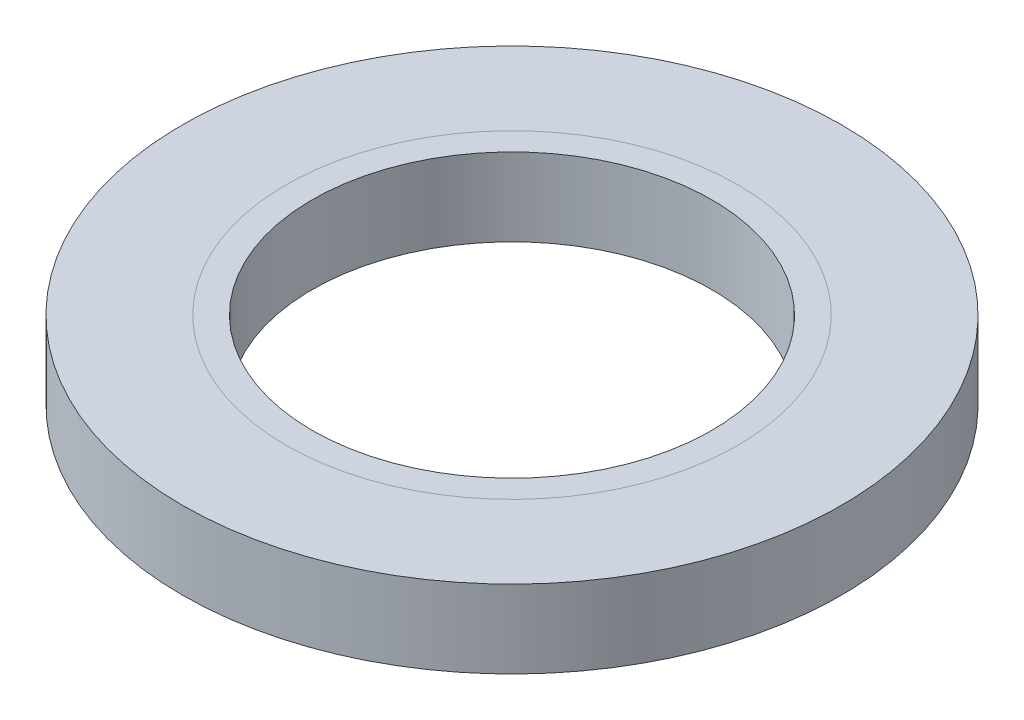
ISO-10303-21;
HEADER;
FILE_DESCRIPTION(('STEP AP214'),'2;1');
FILE_NAME('part.step','',(''),(''),'','','');
FILE_SCHEMA(('AUTOMOTIVE_DESIGN { 1 0 10303 214 1 1 1 1 }'));
ENDSEC;
DATA;
#1=APPLICATION_CONTEXT('core data for automotive mechanical design processes');
#2=APPLICATION_PROTOCOL_DEFINITION('international standard','automotive_design',2000,#1);
#3=PRODUCT_CONTEXT('',#1,'mechanical');
#4=PRODUCT('Part','Part','',(#3));
#5=PRODUCT_RELATED_PRODUCT_CATEGORY('part','',(#4));
#6=PRODUCT_DEFINITION_FORMATION('','',#4);
#7=PRODUCT_DEFINITION_CONTEXT('part definition',#1,'design');
#8=PRODUCT_DEFINITION('design','',#6,#7);
#9=PRODUCT_DEFINITION_SHAPE('','',#8);
#10=(LENGTH_UNIT() NAMED_UNIT(*) SI_UNIT(.MILLI.,.METRE.));
#11=(NAMED_UNIT(*) PLANE_ANGLE_UNIT() SI_UNIT($,.RADIAN.));
#12=(NAMED_UNIT(*) SI_UNIT($,.STERADIAN.) SOLID_ANGLE_UNIT());
#13=UNCERTAINTY_MEASURE_WITH_UNIT(LENGTH_MEASURE(1.E-05),#10,'distance_accuracy_value','');
#14=(GEOMETRIC_REPRESENTATION_CONTEXT(3) GLOBAL_UNCERTAINTY_ASSIGNED_CONTEXT((#13)) GLOBAL_UNIT_ASSIGNED_CONTEXT((#10,
#11,#12)) REPRESENTATION_CONTEXT('',''));
#15=CARTESIAN_POINT('',(0.,0.,0.));
#16=DIRECTION('',(0.,0.,1.));
#17=DIRECTION('',(1.,0.,0.));
#18=AXIS2_PLACEMENT_3D('',#15,#16,#17);
#19=CARTESIAN_POINT('',(0.,7.5,0.));
#20=DIRECTION('',(0.,1.,0.));
#21=DIRECTION('',(0.,0.,1.));
#22=AXIS2_PLACEMENT_3D('',#19,#20,#21);
#23=PLANE('',#22);
#24=CARTESIAN_POINT('',(0.,7.5,0.));
#25=DIRECTION('',(0.,1.,0.));
#26=DIRECTION('',(0.,0.,1.));
#27=AXIS2_PLACEMENT_3D('',#24,#25,#26);
#28=CIRCLE('',#27,63.5);
#29=CARTESIAN_POINT('',(0.,7.5,63.5));
#30=VERTEX_POINT('',#29);
#31=EDGE_CURVE('E11',#30,#30,#28,.T.);
#32=ORIENTED_EDGE('',*,*,#31,.T.);
#33=EDGE_LOOP('',(#32));
#34=FACE_BOUND('',#33,.T.);
#35=CARTESIAN_POINT('',(0.,7.5,0.));
#36=DIRECTION('',(0.,1.,0.));
#37=DIRECTION('',(0.,0.,1.));
#38=AXIS2_PLACEMENT_3D('',#35,#36,#37);
#39=CIRCLE('',#38,43.5);
#40=CARTESIAN_POINT('',(0.,7.5,43.5));
#41=VERTEX_POINT('',#40);
#42=EDGE_CURVE('E50',#41,#41,#39,.T.);
#43=ORIENTED_EDGE('',*,*,#42,.F.);
#44=EDGE_LOOP('',(#43));
#45=FACE_BOUND('',#44,.T.);
#46=ADVANCED_FACE('F39',(#34,#45),#23,.T.);
#47=CARTESIAN_POINT('',(0.,-7.5,0.));
#48=DIRECTION('',(0.,1.,0.));
#49=DIRECTION('',(0.,0.,1.));
#50=AXIS2_PLACEMENT_3D('',#47,#48,#49);
#51=PLANE('',#50);
#52=CARTESIAN_POINT('',(0.,-7.5,0.));
#53=DIRECTION('',(0.,1.,0.));
#54=DIRECTION('',(0.,0.,1.));
#55=AXIS2_PLACEMENT_3D('',#52,#53,#54);
#56=CIRCLE('',#55,63.5);
#57=CARTESIAN_POINT('',(0.,-7.5,63.5));
#58=VERTEX_POINT('',#57);
#59=EDGE_CURVE('E43',#58,#58,#56,.T.);
#60=ORIENTED_EDGE('',*,*,#59,.F.);
#61=EDGE_LOOP('',(#60));
#62=FACE_BOUND('',#61,.T.);
#63=CARTESIAN_POINT('',(0.,-7.5,0.));
#64=DIRECTION('',(0.,1.,0.));
#65=DIRECTION('',(0.,0.,1.));
#66=AXIS2_PLACEMENT_3D('',#63,#64,#65);
#67=CIRCLE('',#66,43.5);
#68=CARTESIAN_POINT('',(0.,-7.5,43.5));
#69=VERTEX_POINT('',#68);
#70=EDGE_CURVE('E52',#69,#69,#67,.T.);
#71=ORIENTED_EDGE('',*,*,#70,.T.);
#72=EDGE_LOOP('',(#71));
#73=FACE_BOUND('',#72,.T.);
#74=ADVANCED_FACE('F62',(#62,#73),#51,.F.);
#75=CARTESIAN_POINT('',(0.,7.5,0.));
#76=DIRECTION('',(0.,-1.,0.));
#77=DIRECTION('',(0.,0.,-1.));
#78=AXIS2_PLACEMENT_3D('',#75,#76,#77);
#79=CYLINDRICAL_SURFACE('',#78,63.5);
#80=ORIENTED_EDGE('',*,*,#31,.F.);
#81=EDGE_LOOP('',(#80));
#82=FACE_BOUND('',#81,.T.);
#83=ORIENTED_EDGE('',*,*,#59,.T.);
#84=EDGE_LOOP('',(#83));
#85=FACE_BOUND('',#84,.T.);
#86=ADVANCED_FACE('F41',(#82,#85),#79,.T.);
#87=CARTESIAN_POINT('',(0.,7.5,0.));
#88=DIRECTION('',(0.,-1.,0.));
#89=DIRECTION('',(0.,0.,-1.));
#90=AXIS2_PLACEMENT_3D('',#87,#88,#89);
#91=CYLINDRICAL_SURFACE('',#90,43.5);
#92=ORIENTED_EDGE('',*,*,#42,.T.);
#93=EDGE_LOOP('',(#92));
#94=FACE_BOUND('',#93,.T.);
#95=ORIENTED_EDGE('',*,*,#70,.F.);
#96=EDGE_LOOP('',(#95));
#97=FACE_BOUND('',#96,.T.);
#98=ADVANCED_FACE('F58',(#94,#97),#91,.F.);
#99=CLOSED_SHELL('',(#46,#74,#86,#98));
#100=MANIFOLD_SOLID_BREP('B2',#99);
#101=CARTESIAN_POINT('',(0.,7.5,0.));
#102=DIRECTION('',(0.,1.,0.));
#103=DIRECTION('',(0.,0.,1.));
#104=AXIS2_PLACEMENT_3D('',#101,#102,#103);
#105=PLANE('',#104);
#106=CARTESIAN_POINT('',(0.,7.5,0.));
#107=DIRECTION('',(0.,1.,0.));
#108=DIRECTION('',(0.,0.,1.));
#109=AXIS2_PLACEMENT_3D('',#106,#107,#108);
#110=CIRCLE('',#109,43.5);
#111=CARTESIAN_POINT('',(0.,7.5,43.5));
#112=VERTEX_POINT('',#111);
#113=EDGE_CURVE('E38',#112,#112,#110,.T.);
#114=ORIENTED_EDGE('',*,*,#113,.T.);
#115=EDGE_LOOP('',(#114));
#116=FACE_BOUND('',#115,.T.);
#117=CARTESIAN_POINT('',(0.,7.5,0.));
#118=DIRECTION('',(0.,1.,0.));
#119=DIRECTION('',(0.,0.,1.));
#120=AXIS2_PLACEMENT_3D('',#117,#118,#119);
#121=CIRCLE('',#120,38.5);
#122=CARTESIAN_POINT('',(0.,7.5,38.5));
#123=VERTEX_POINT('',#122);
#124=EDGE_CURVE('E112',#123,#123,#121,.T.);
#125=ORIENTED_EDGE('',*,*,#124,.F.);
#126=EDGE_LOOP('',(#125));
#127=FACE_BOUND('',#126,.T.);
#128=ADVANCED_FACE('F101',(#116,#127),#105,.T.);
#129=CARTESIAN_POINT('',(0.,-7.5,0.));
#130=DIRECTION('',(0.,1.,0.));
#131=DIRECTION('',(0.,0.,1.));
#132=AXIS2_PLACEMENT_3D('',#129,#130,#131);
#133=PLANE('',#132);
#134=CARTESIAN_POINT('',(0.,-7.5,0.));
#135=DIRECTION('',(0.,1.,0.));
#136=DIRECTION('',(0.,0.,1.));
#137=AXIS2_PLACEMENT_3D('',#134,#135,#136);
#138=CIRCLE('',#137,43.5);
#139=CARTESIAN_POINT('',(0.,-7.5,43.5));
#140=VERTEX_POINT('',#139);
#141=EDGE_CURVE('E105',#140,#140,#138,.T.);
#142=ORIENTED_EDGE('',*,*,#141,.F.);
#143=EDGE_LOOP('',(#142));
#144=FACE_BOUND('',#143,.T.);
#145=CARTESIAN_POINT('',(0.,-7.5,0.));
#146=DIRECTION('',(0.,1.,0.));
#147=DIRECTION('',(0.,0.,1.));
#148=AXIS2_PLACEMENT_3D('',#145,#146,#147);
#149=CIRCLE('',#148,38.5);
#150=CARTESIAN_POINT('',(0.,-7.5,38.5));
#151=VERTEX_POINT('',#150);
#152=EDGE_CURVE('E114',#151,#151,#149,.T.);
#153=ORIENTED_EDGE('',*,*,#152,.T.);
#154=EDGE_LOOP('',(#153));
#155=FACE_BOUND('',#154,.T.);
#156=ADVANCED_FACE('F124',(#144,#155),#133,.F.);
#157=CARTESIAN_POINT('',(0.,7.5,0.));
#158=DIRECTION('',(0.,-1.,0.));
#159=DIRECTION('',(0.,0.,-1.));
#160=AXIS2_PLACEMENT_3D('',#157,#158,#159);
#161=CYLINDRICAL_SURFACE('',#160,43.5);
#162=ORIENTED_EDGE('',*,*,#113,.F.);
#163=EDGE_LOOP('',(#162));
#164=FACE_BOUND('',#163,.T.);
#165=ORIENTED_EDGE('',*,*,#141,.T.);
#166=EDGE_LOOP('',(#165));
#167=FACE_BOUND('',#166,.T.);
#168=ADVANCED_FACE('F103',(#164,#167),#161,.T.);
#169=CARTESIAN_POINT('',(0.,7.5,0.));
#170=DIRECTION('',(0.,-1.,0.));
#171=DIRECTION('',(0.,0.,-1.));
#172=AXIS2_PLACEMENT_3D('',#169,#170,#171);
#173=CYLINDRICAL_SURFACE('',#172,38.5);
#174=ORIENTED_EDGE('',*,*,#124,.T.);
#175=EDGE_LOOP('',(#174));
#176=FACE_BOUND('',#175,.T.);
#177=ORIENTED_EDGE('',*,*,#152,.F.);
#178=EDGE_LOOP('',(#177));
#179=FACE_BOUND('',#178,.T.);
#180=ADVANCED_FACE('F120',(#176,#179),#173,.F.);
#181=CLOSED_SHELL('',(#128,#156,#168,#180));
#182=MANIFOLD_SOLID_BREP('B6',#181);
#183=ADVANCED_BREP_SHAPE_REPRESENTATION('',(#18,#100,#182),#14);
#184=SHAPE_DEFINITION_REPRESENTATION(#9,#183);
ENDSEC;
END-ISO-10303-21;
